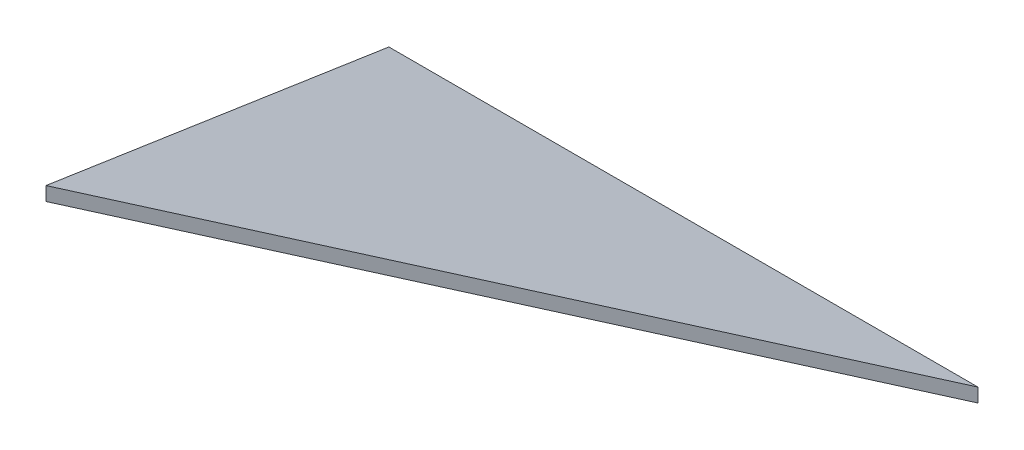
ISO-10303-21;
HEADER;
FILE_DESCRIPTION(('STEP AP214'),'2;1');
FILE_NAME('part.step','',(''),(''),'','','');
FILE_SCHEMA(('AUTOMOTIVE_DESIGN { 1 0 10303 214 1 1 1 1 }'));
ENDSEC;
DATA;
#1=APPLICATION_CONTEXT('core data for automotive mechanical design processes');
#2=APPLICATION_PROTOCOL_DEFINITION('international standard','automotive_design',2000,#1);
#3=PRODUCT_CONTEXT('',#1,'mechanical');
#4=PRODUCT('Part','Part','',(#3));
#5=PRODUCT_RELATED_PRODUCT_CATEGORY('part','',(#4));
#6=PRODUCT_DEFINITION_FORMATION('','',#4);
#7=PRODUCT_DEFINITION_CONTEXT('part definition',#1,'design');
#8=PRODUCT_DEFINITION('design','',#6,#7);
#9=PRODUCT_DEFINITION_SHAPE('','',#8);
#10=(LENGTH_UNIT() NAMED_UNIT(*) SI_UNIT(.MILLI.,.METRE.));
#11=(NAMED_UNIT(*) PLANE_ANGLE_UNIT() SI_UNIT($,.RADIAN.));
#12=(NAMED_UNIT(*) SI_UNIT($,.STERADIAN.) SOLID_ANGLE_UNIT());
#13=UNCERTAINTY_MEASURE_WITH_UNIT(LENGTH_MEASURE(1.E-05),#10,'distance_accuracy_value','');
#14=(GEOMETRIC_REPRESENTATION_CONTEXT(3) GLOBAL_UNCERTAINTY_ASSIGNED_CONTEXT((#13)) GLOBAL_UNIT_ASSIGNED_CONTEXT((#10,
#11,#12)) REPRESENTATION_CONTEXT('',''));
#15=CARTESIAN_POINT('',(0.,0.,0.));
#16=DIRECTION('',(0.,0.,1.));
#17=DIRECTION('',(1.,0.,0.));
#18=AXIS2_PLACEMENT_3D('',#15,#16,#17);
#19=CARTESIAN_POINT('',(-57.15,152.4,0.));
#20=DIRECTION('',(0.,0.,1.));
#21=DIRECTION('',(1.,0.,0.));
#22=AXIS2_PLACEMENT_3D('',#19,#20,#21);
#23=PLANE('',#22);
#24=DIRECTION('',(-1.,0.,0.));
#25=VECTOR('',#24,1.);
#26=CARTESIAN_POINT('',(-57.15,6.61458333333331,0.));
#27=LINE('',#26,#25);
#28=CARTESIAN_POINT('',(224.536,6.61458333333331,0.));
#29=VERTEX_POINT('',#28);
#30=CARTESIAN_POINT('',(-57.15,6.61458333333331,0.));
#31=VERTEX_POINT('',#30);
#32=EDGE_CURVE('E76',#29,#31,#27,.T.);
#33=ORIENTED_EDGE('',*,*,#32,.F.);
#34=DIRECTION('',(0.,-1.,0.));
#35=VECTOR('',#34,1.);
#36=CARTESIAN_POINT('',(224.536,152.4,0.));
#37=LINE('',#36,#35);
#38=CARTESIAN_POINT('',(224.536,0.,0.));
#39=VERTEX_POINT('',#38);
#40=EDGE_CURVE('E49',#29,#39,#37,.T.);
#41=ORIENTED_EDGE('',*,*,#40,.T.);
#42=DIRECTION('',(-1.,0.,0.));
#43=VECTOR('',#42,1.);
#44=CARTESIAN_POINT('',(-57.15,0.,0.));
#45=LINE('',#44,#43);
#46=CARTESIAN_POINT('',(-57.15,0.,0.));
#47=VERTEX_POINT('',#46);
#48=EDGE_CURVE('E93',#39,#47,#45,.T.);
#49=ORIENTED_EDGE('',*,*,#48,.T.);
#50=DIRECTION('',(0.,-1.,0.));
#51=VECTOR('',#50,1.);
#52=CARTESIAN_POINT('',(-57.15,152.4,0.));
#53=LINE('',#52,#51);
#54=EDGE_CURVE('E56',#31,#47,#53,.T.);
#55=ORIENTED_EDGE('',*,*,#54,.F.);
#56=EDGE_LOOP('',(#33,#41,#49,#55));
#57=FACE_BOUND('',#56,.T.);
#58=ADVANCED_FACE('F40',(#57),#23,.F.);
#59=CARTESIAN_POINT('',(-24.3576833527357,152.4,196.753899883586));
#60=DIRECTION('',(0.986393923832144,0.,-0.164398987305357));
#61=DIRECTION('',(-0.164398987305357,0.,-0.986393923832144));
#62=AXIS2_PLACEMENT_3D('',#59,#60,#61);
#63=PLANE('',#62);
#64=DIRECTION('',(0.157990501106673,0.276483376936677,0.947943006640037));
#65=VECTOR('',#64,1.);
#66=CARTESIAN_POINT('',(-20.4962665805817,70.7586168173153,219.92240051651));
#67=LINE('',#66,#65);
#68=CARTESIAN_POINT('',(-24.3576833527358,64.0011374660458,196.753899883586));
#69=VERTEX_POINT('',#68);
#70=EDGE_CURVE('E84',#31,#69,#67,.T.);
#71=ORIENTED_EDGE('',*,*,#70,.F.);
#72=ORIENTED_EDGE('',*,*,#54,.T.);
#73=DIRECTION('',(0.157990501106673,0.276483376936677,0.947943006640037));
#74=VECTOR('',#73,1.);
#75=CARTESIAN_POINT('',(-20.2073300231194,64.649672459541,221.656019861283));
#76=LINE('',#75,#74);
#77=CARTESIAN_POINT('',(-24.3576833527357,57.3865541327125,196.753899883586));
#78=VERTEX_POINT('',#77);
#79=EDGE_CURVE('E98',#47,#78,#76,.T.);
#80=ORIENTED_EDGE('',*,*,#79,.T.);
#81=DIRECTION('',(0.,-1.,0.));
#82=VECTOR('',#81,1.);
#83=CARTESIAN_POINT('',(-24.3576833527357,152.4,196.753899883586));
#84=LINE('',#83,#82);
#85=EDGE_CURVE('E12',#69,#78,#84,.T.);
#86=ORIENTED_EDGE('',*,*,#85,.F.);
#87=EDGE_LOOP('',(#71,#72,#80,#86));
#88=FACE_BOUND('',#87,.T.);
#89=ADVANCED_FACE('F42',(#88),#63,.F.);
#90=CARTESIAN_POINT('',(224.536,152.4,0.));
#91=DIRECTION('',(-0.620146840249803,0.,-0.784485752916001));
#92=DIRECTION('',(-0.784485752916001,0.,0.620146840249803));
#93=AXIS2_PLACEMENT_3D('',#90,#91,#92);
#94=PLANE('',#93);
#95=DIRECTION('',(0.771959593647215,-0.177988048601136,-0.61024473806104));
#96=VECTOR('',#95,1.);
#97=CARTESIAN_POINT('',(204.505144736093,11.2330282229033,15.8346681928115));
#98=LINE('',#97,#96);
#99=EDGE_CURVE('E86',#69,#29,#98,.T.);
#100=ORIENTED_EDGE('',*,*,#99,.F.);
#101=ORIENTED_EDGE('',*,*,#85,.T.);
#102=DIRECTION('',(0.771959593647215,-0.177988048601136,-0.61024473806104));
#103=VECTOR('',#102,1.);
#104=CARTESIAN_POINT('',(203.596303753158,4.82799320579372,16.5531195627212));
#105=LINE('',#104,#103);
#106=EDGE_CURVE('E83',#78,#39,#105,.T.);
#107=ORIENTED_EDGE('',*,*,#106,.T.);
#108=ORIENTED_EDGE('',*,*,#40,.F.);
#109=EDGE_LOOP('',(#100,#101,#107,#108));
#110=FACE_BOUND('',#109,.T.);
#111=ADVANCED_FACE('F90',(#110),#94,.F.);
#112=CARTESIAN_POINT('',(224.536,0.,0.));
#113=DIRECTION('',(0.,0.96,-0.28));
#114=DIRECTION('',(0.,0.28,0.96));
#115=AXIS2_PLACEMENT_3D('',#112,#113,#114);
#116=PLANE('',#115);
#117=ORIENTED_EDGE('',*,*,#48,.F.);
#118=ORIENTED_EDGE('',*,*,#106,.F.);
#119=ORIENTED_EDGE('',*,*,#79,.F.);
#120=EDGE_LOOP('',(#117,#118,#119));
#121=FACE_BOUND('',#120,.T.);
#122=ADVANCED_FACE('F105',(#121),#116,.F.);
#123=CARTESIAN_POINT('',(224.536,6.096,-1.778));
#124=DIRECTION('',(0.,0.96,-0.28));
#125=DIRECTION('',(0.,0.28,0.96));
#126=AXIS2_PLACEMENT_3D('',#123,#124,#125);
#127=PLANE('',#126);
#128=ORIENTED_EDGE('',*,*,#32,.T.);
#129=ORIENTED_EDGE('',*,*,#70,.T.);
#130=ORIENTED_EDGE('',*,*,#99,.T.);
#131=EDGE_LOOP('',(#128,#129,#130));
#132=FACE_BOUND('',#131,.T.);
#133=ADVANCED_FACE('F87',(#132),#127,.T.);
#134=CLOSED_SHELL('',(#58,#89,#111,#122,#133));
#135=MANIFOLD_SOLID_BREP('B2',#134);
#136=ADVANCED_BREP_SHAPE_REPRESENTATION('',(#18,#135),#14);
#137=SHAPE_DEFINITION_REPRESENTATION(#9,#136);
ENDSEC;
END-ISO-10303-21;
